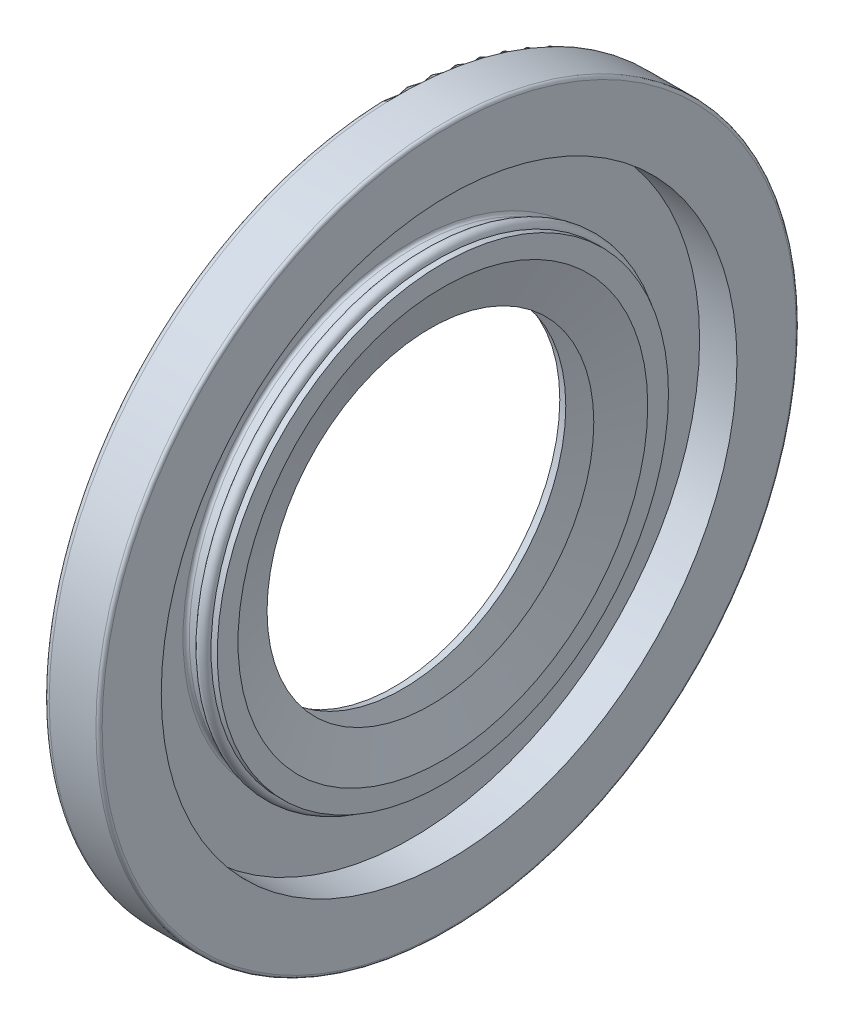
ISO-10303-21;
HEADER;
FILE_DESCRIPTION(('STEP AP214'),'2;1');
FILE_NAME('part.step','',(''),(''),'','','');
FILE_SCHEMA(('AUTOMOTIVE_DESIGN { 1 0 10303 214 1 1 1 1 }'));
ENDSEC;
DATA;
#1=APPLICATION_CONTEXT('core data for automotive mechanical design processes');
#2=APPLICATION_PROTOCOL_DEFINITION('international standard','automotive_design',2000,#1);
#3=PRODUCT_CONTEXT('',#1,'mechanical');
#4=PRODUCT('Part','Part','',(#3));
#5=PRODUCT_RELATED_PRODUCT_CATEGORY('part','',(#4));
#6=PRODUCT_DEFINITION_FORMATION('','',#4);
#7=PRODUCT_DEFINITION_CONTEXT('part definition',#1,'design');
#8=PRODUCT_DEFINITION('design','',#6,#7);
#9=PRODUCT_DEFINITION_SHAPE('','',#8);
#10=(LENGTH_UNIT() NAMED_UNIT(*) SI_UNIT(.MILLI.,.METRE.));
#11=(NAMED_UNIT(*) PLANE_ANGLE_UNIT() SI_UNIT($,.RADIAN.));
#12=(NAMED_UNIT(*) SI_UNIT($,.STERADIAN.) SOLID_ANGLE_UNIT());
#13=UNCERTAINTY_MEASURE_WITH_UNIT(LENGTH_MEASURE(1.E-05),#10,'distance_accuracy_value','');
#14=(GEOMETRIC_REPRESENTATION_CONTEXT(3) GLOBAL_UNCERTAINTY_ASSIGNED_CONTEXT((#13)) GLOBAL_UNIT_ASSIGNED_CONTEXT((#10,
#11,#12)) REPRESENTATION_CONTEXT('',''));
#15=CARTESIAN_POINT('',(0.,0.,0.));
#16=DIRECTION('',(0.,0.,1.));
#17=DIRECTION('',(1.,0.,0.));
#18=AXIS2_PLACEMENT_3D('',#15,#16,#17);
#19=CARTESIAN_POINT('',(0.,73.666666666667,0.));
#20=DIRECTION('',(-1.,0.,0.));
#21=DIRECTION('',(0.,0.,1.));
#22=AXIS2_PLACEMENT_3D('',#19,#20,#21);
#23=PLANE('',#22);
#24=CARTESIAN_POINT('',(0.,0.,0.));
#25=DIRECTION('',(1.,0.,0.));
#26=DIRECTION('',(0.,0.,-1.));
#27=AXIS2_PLACEMENT_3D('',#24,#25,#26);
#28=CIRCLE('',#27,61.666666666667);
#29=CARTESIAN_POINT('',(0.,0.,-61.666666666667));
#30=VERTEX_POINT('',#29);
#31=EDGE_CURVE('E5',#30,#30,#28,.T.);
#32=ORIENTED_EDGE('',*,*,#31,.T.);
#33=EDGE_LOOP('',(#32));
#34=FACE_BOUND('',#33,.T.);
#35=CARTESIAN_POINT('',(0.,0.,0.));
#36=DIRECTION('',(1.,0.,0.));
#37=DIRECTION('',(0.,0.,-1.));
#38=AXIS2_PLACEMENT_3D('',#35,#36,#37);
#39=CIRCLE('',#38,73.6666666666671);
#40=CARTESIAN_POINT('',(0.,0.,-73.6666666666671));
#41=VERTEX_POINT('',#40);
#42=EDGE_CURVE('E9',#41,#41,#39,.T.);
#43=ORIENTED_EDGE('',*,*,#42,.F.);
#44=EDGE_LOOP('',(#43));
#45=FACE_BOUND('',#44,.T.);
#46=ADVANCED_FACE('F13',(#34,#45),#23,.T.);
#47=CARTESIAN_POINT('',(12.,0.,0.));
#48=DIRECTION('',(1.,0.,0.));
#49=DIRECTION('',(0.,0.,-1.));
#50=AXIS2_PLACEMENT_3D('',#47,#48,#49);
#51=CYLINDRICAL_SURFACE('',#50,61.666666666667);
#52=CARTESIAN_POINT('',(0.199999999999999,0.,0.));
#53=DIRECTION('',(1.,0.,0.));
#54=DIRECTION('',(0.,0.,-1.));
#55=AXIS2_PLACEMENT_3D('',#52,#53,#54);
#56=CIRCLE('',#55,61.666666666667);
#57=CARTESIAN_POINT('',(0.199999999999999,0.,-61.666666666667));
#58=VERTEX_POINT('',#57);
#59=EDGE_CURVE('E24',#58,#58,#56,.T.);
#60=ORIENTED_EDGE('',*,*,#59,.T.);
#61=EDGE_LOOP('',(#60));
#62=FACE_BOUND('',#61,.T.);
#63=ORIENTED_EDGE('',*,*,#31,.F.);
#64=EDGE_LOOP('',(#63));
#65=FACE_BOUND('',#64,.T.);
#66=ADVANCED_FACE('F30',(#62,#65),#51,.F.);
#67=CARTESIAN_POINT('',(1.33333333333288,0.,0.));
#68=DIRECTION('',(1.,0.,0.));
#69=DIRECTION('',(0.,0.,-1.));
#70=AXIS2_PLACEMENT_3D('',#67,#68,#69);
#71=TOROIDAL_SURFACE('',#70,73.6666666666671,1.33333333333288);
#72=ORIENTED_EDGE('',*,*,#42,.T.);
#73=EDGE_LOOP('',(#72));
#74=FACE_BOUND('',#73,.T.);
#75=CARTESIAN_POINT('',(1.3333333333333,0.,0.));
#76=DIRECTION('',(1.,0.,0.));
#77=DIRECTION('',(0.,0.,-1.));
#78=AXIS2_PLACEMENT_3D('',#75,#76,#77);
#79=CIRCLE('',#78,75.);
#80=CARTESIAN_POINT('',(1.3333333333333,0.,-75.));
#81=VERTEX_POINT('',#80);
#82=EDGE_CURVE('E39',#81,#81,#79,.T.);
#83=ORIENTED_EDGE('',*,*,#82,.F.);
#84=EDGE_LOOP('',(#83));
#85=FACE_BOUND('',#84,.T.);
#86=ADVANCED_FACE('F43',(#74,#85),#71,.T.);
#87=CARTESIAN_POINT('',(0.2,61.666666666667,0.));
#88=DIRECTION('',(-1.,0.,0.));
#89=DIRECTION('',(0.,0.,1.));
#90=AXIS2_PLACEMENT_3D('',#87,#88,#89);
#91=PLANE('',#90);
#92=CARTESIAN_POINT('',(0.199999999999999,0.,0.));
#93=DIRECTION('',(1.,0.,0.));
#94=DIRECTION('',(0.,0.,-1.));
#95=AXIS2_PLACEMENT_3D('',#92,#93,#94);
#96=CIRCLE('',#95,48.333333333333);
#97=CARTESIAN_POINT('',(0.199999999999999,0.,-48.333333333333));
#98=VERTEX_POINT('',#97);
#99=EDGE_CURVE('E50',#98,#98,#96,.T.);
#100=ORIENTED_EDGE('',*,*,#99,.T.);
#101=EDGE_LOOP('',(#100));
#102=FACE_BOUND('',#101,.T.);
#103=ORIENTED_EDGE('',*,*,#59,.F.);
#104=EDGE_LOOP('',(#103));
#105=FACE_BOUND('',#104,.T.);
#106=ADVANCED_FACE('F56',(#102,#105),#91,.T.);
#107=CARTESIAN_POINT('',(12.,0.,0.));
#108=DIRECTION('',(1.,0.,0.));
#109=DIRECTION('',(0.,0.,-1.));
#110=AXIS2_PLACEMENT_3D('',#107,#108,#109);
#111=CYLINDRICAL_SURFACE('',#110,75.);
#112=ORIENTED_EDGE('',*,*,#82,.T.);
#113=EDGE_LOOP('',(#112));
#114=FACE_BOUND('',#113,.T.);
#115=CARTESIAN_POINT('',(11.333333333333,0.,0.));
#116=DIRECTION('',(1.,0.,0.));
#117=DIRECTION('',(0.,0.,-1.));
#118=AXIS2_PLACEMENT_3D('',#115,#116,#117);
#119=CIRCLE('',#118,75.);
#120=CARTESIAN_POINT('',(11.333333333333,0.,-75.));
#121=VERTEX_POINT('',#120);
#122=EDGE_CURVE('E65',#121,#121,#119,.T.);
#123=ORIENTED_EDGE('',*,*,#122,.F.);
#124=EDGE_LOOP('',(#123));
#125=FACE_BOUND('',#124,.T.);
#126=ADVANCED_FACE('F69',(#114,#125),#111,.T.);
#127=CARTESIAN_POINT('',(12.,0.,0.));
#128=DIRECTION('',(1.,0.,0.));
#129=DIRECTION('',(0.,0.,-1.));
#130=AXIS2_PLACEMENT_3D('',#127,#128,#129);
#131=CYLINDRICAL_SURFACE('',#130,48.333333333333);
#132=CARTESIAN_POINT('',(0.,0.,0.));
#133=DIRECTION('',(1.,0.,0.));
#134=DIRECTION('',(0.,0.,-1.));
#135=AXIS2_PLACEMENT_3D('',#132,#133,#134);
#136=CIRCLE('',#135,48.333333333333);
#137=CARTESIAN_POINT('',(0.,0.,-48.333333333333));
#138=VERTEX_POINT('',#137);
#139=EDGE_CURVE('E76',#138,#138,#136,.T.);
#140=ORIENTED_EDGE('',*,*,#139,.T.);
#141=EDGE_LOOP('',(#140));
#142=FACE_BOUND('',#141,.T.);
#143=ORIENTED_EDGE('',*,*,#99,.F.);
#144=EDGE_LOOP('',(#143));
#145=FACE_BOUND('',#144,.T.);
#146=ADVANCED_FACE('F82',(#142,#145),#131,.T.);
#147=CARTESIAN_POINT('',(11.3333333333321,0.,0.));
#148=DIRECTION('',(1.,0.,0.));
#149=DIRECTION('',(0.,0.,-1.));
#150=AXIS2_PLACEMENT_3D('',#147,#148,#149);
#151=TOROIDAL_SURFACE('',#150,74.3333333333321,0.666666666667901);
#152=ORIENTED_EDGE('',*,*,#122,.T.);
#153=EDGE_LOOP('',(#152));
#154=FACE_BOUND('',#153,.T.);
#155=CARTESIAN_POINT('',(12.,0.,0.));
#156=DIRECTION('',(1.,0.,0.));
#157=DIRECTION('',(0.,0.,-1.));
#158=AXIS2_PLACEMENT_3D('',#155,#156,#157);
#159=CIRCLE('',#158,74.3333333858985);
#160=CARTESIAN_POINT('',(12.,0.,-74.3333333858985));
#161=VERTEX_POINT('',#160);
#162=EDGE_CURVE('E91',#161,#161,#159,.T.);
#163=ORIENTED_EDGE('',*,*,#162,.F.);
#164=EDGE_LOOP('',(#163));
#165=FACE_BOUND('',#164,.T.);
#166=ADVANCED_FACE('F95',(#154,#165),#151,.T.);
#167=CARTESIAN_POINT('',(0.,48.333333333333,0.));
#168=DIRECTION('',(-1.,0.,0.));
#169=DIRECTION('',(0.,0.,1.));
#170=AXIS2_PLACEMENT_3D('',#167,#168,#169);
#171=PLANE('',#170);
#172=CARTESIAN_POINT('',(0.,0.,0.));
#173=DIRECTION('',(1.,0.,0.));
#174=DIRECTION('',(0.,0.,-1.));
#175=AXIS2_PLACEMENT_3D('',#172,#173,#174);
#176=CIRCLE('',#175,45.);
#177=CARTESIAN_POINT('',(0.,0.,-45.));
#178=VERTEX_POINT('',#177);
#179=EDGE_CURVE('E102',#178,#178,#176,.T.);
#180=ORIENTED_EDGE('',*,*,#179,.T.);
#181=EDGE_LOOP('',(#180));
#182=FACE_BOUND('',#181,.T.);
#183=ORIENTED_EDGE('',*,*,#139,.F.);
#184=EDGE_LOOP('',(#183));
#185=FACE_BOUND('',#184,.T.);
#186=ADVANCED_FACE('F108',(#182,#185),#171,.T.);
#187=CARTESIAN_POINT('',(12.,61.666666666667,0.));
#188=DIRECTION('',(1.,0.,0.));
#189=DIRECTION('',(0.,0.,-1.));
#190=AXIS2_PLACEMENT_3D('',#187,#188,#189);
#191=PLANE('',#190);
#192=ORIENTED_EDGE('',*,*,#162,.T.);
#193=EDGE_LOOP('',(#192));
#194=FACE_BOUND('',#193,.T.);
#195=CARTESIAN_POINT('',(12.,0.,0.));
#196=DIRECTION('',(1.,0.,0.));
#197=DIRECTION('',(0.,0.,-1.));
#198=AXIS2_PLACEMENT_3D('',#195,#196,#197);
#199=CIRCLE('',#198,61.666666666667);
#200=CARTESIAN_POINT('',(12.,0.,-61.666666666667));
#201=VERTEX_POINT('',#200);
#202=EDGE_CURVE('E117',#201,#201,#199,.T.);
#203=ORIENTED_EDGE('',*,*,#202,.F.);
#204=EDGE_LOOP('',(#203));
#205=FACE_BOUND('',#204,.T.);
#206=ADVANCED_FACE('F121',(#194,#205),#191,.T.);
#207=CARTESIAN_POINT('',(0.,0.,0.));
#208=DIRECTION('',(-1.,0.,0.));
#209=DIRECTION('',(0.,0.,1.));
#210=AXIS2_PLACEMENT_3D('',#207,#208,#209);
#211=CONICAL_SURFACE('',#210,45.,1.03037682652427);
#212=CARTESIAN_POINT('',(2.,0.,0.));
#213=DIRECTION('',(1.,0.,0.));
#214=DIRECTION('',(0.,0.,-1.));
#215=AXIS2_PLACEMENT_3D('',#212,#213,#214);
#216=CIRCLE('',#215,41.666666666667);
#217=CARTESIAN_POINT('',(2.,0.,-41.666666666667));
#218=VERTEX_POINT('',#217);
#219=EDGE_CURVE('E128',#218,#218,#216,.T.);
#220=ORIENTED_EDGE('',*,*,#219,.T.);
#221=EDGE_LOOP('',(#220));
#222=FACE_BOUND('',#221,.T.);
#223=ORIENTED_EDGE('',*,*,#179,.F.);
#224=EDGE_LOOP('',(#223));
#225=FACE_BOUND('',#224,.T.);
#226=ADVANCED_FACE('F134',(#222,#225),#211,.F.);
#227=CARTESIAN_POINT('',(12.,0.,0.));
#228=DIRECTION('',(1.,0.,0.));
#229=DIRECTION('',(0.,0.,-1.));
#230=AXIS2_PLACEMENT_3D('',#227,#228,#229);
#231=CYLINDRICAL_SURFACE('',#230,61.666666666667);
#232=ORIENTED_EDGE('',*,*,#202,.T.);
#233=EDGE_LOOP('',(#232));
#234=FACE_BOUND('',#233,.T.);
#235=CARTESIAN_POINT('',(4.,0.,0.));
#236=DIRECTION('',(1.,0.,0.));
#237=DIRECTION('',(0.,0.,-1.));
#238=AXIS2_PLACEMENT_3D('',#235,#236,#237);
#239=CIRCLE('',#238,61.666666666667);
#240=CARTESIAN_POINT('',(4.,0.,-61.666666666667));
#241=VERTEX_POINT('',#240);
#242=EDGE_CURVE('E143',#241,#241,#239,.T.);
#243=ORIENTED_EDGE('',*,*,#242,.F.);
#244=EDGE_LOOP('',(#243));
#245=FACE_BOUND('',#244,.T.);
#246=ADVANCED_FACE('F147',(#234,#245),#231,.F.);
#247=CARTESIAN_POINT('',(2.,0.,0.));
#248=DIRECTION('',(1.,0.,0.));
#249=DIRECTION('',(0.,0.,-1.));
#250=AXIS2_PLACEMENT_3D('',#247,#248,#249);
#251=CONICAL_SURFACE('',#250,41.666666666667,1.27933953231706);
#252=CARTESIAN_POINT('',(0.165137614678901,0.,0.));
#253=DIRECTION('',(1.,0.,0.));
#254=DIRECTION('',(0.,0.,-1.));
#255=AXIS2_PLACEMENT_3D('',#252,#253,#254);
#256=CIRCLE('',#255,35.550458715596);
#257=CARTESIAN_POINT('',(0.165137614678901,0.,-35.550458715596));
#258=VERTEX_POINT('',#257);
#259=EDGE_CURVE('E154',#258,#258,#256,.T.);
#260=ORIENTED_EDGE('',*,*,#259,.T.);
#261=EDGE_LOOP('',(#260));
#262=FACE_BOUND('',#261,.T.);
#263=ORIENTED_EDGE('',*,*,#219,.F.);
#264=EDGE_LOOP('',(#263));
#265=FACE_BOUND('',#264,.T.);
#266=ADVANCED_FACE('F160',(#262,#265),#251,.T.);
#267=CARTESIAN_POINT('',(4.,48.999999833333,0.));
#268=DIRECTION('',(1.,0.,0.));
#269=DIRECTION('',(0.,0.,-1.));
#270=AXIS2_PLACEMENT_3D('',#267,#268,#269);
#271=PLANE('',#270);
#272=ORIENTED_EDGE('',*,*,#242,.T.);
#273=EDGE_LOOP('',(#272));
#274=FACE_BOUND('',#273,.T.);
#275=CARTESIAN_POINT('',(4.,0.,0.));
#276=DIRECTION('',(1.,0.,0.));
#277=DIRECTION('',(0.,0.,-1.));
#278=AXIS2_PLACEMENT_3D('',#275,#276,#277);
#279=CIRCLE('',#278,48.9999998921038);
#280=CARTESIAN_POINT('',(4.,0.,-48.9999998921038));
#281=VERTEX_POINT('',#280);
#282=EDGE_CURVE('E169',#281,#281,#279,.T.);
#283=ORIENTED_EDGE('',*,*,#282,.F.);
#284=EDGE_LOOP('',(#283));
#285=FACE_BOUND('',#284,.T.);
#286=ADVANCED_FACE('F173',(#274,#285),#271,.T.);
#287=CARTESIAN_POINT('',(0.165137614678901,0.,0.));
#288=DIRECTION('',(-1.,0.,0.));
#289=DIRECTION('',(0.,0.,1.));
#290=AXIS2_PLACEMENT_3D('',#287,#288,#289);
#291=CONICAL_SURFACE('',#290,35.550458715596,0.291456794477702);
#292=CARTESIAN_POINT('',(2.,0.,0.));
#293=DIRECTION('',(1.,0.,0.));
#294=DIRECTION('',(0.,0.,-1.));
#295=AXIS2_PLACEMENT_3D('',#292,#293,#294);
#296=CIRCLE('',#295,35.);
#297=CARTESIAN_POINT('',(2.,0.,-35.));
#298=VERTEX_POINT('',#297);
#299=EDGE_CURVE('E180',#298,#298,#296,.T.);
#300=ORIENTED_EDGE('',*,*,#299,.T.);
#301=EDGE_LOOP('',(#300));
#302=FACE_BOUND('',#301,.T.);
#303=ORIENTED_EDGE('',*,*,#259,.F.);
#304=EDGE_LOOP('',(#303));
#305=FACE_BOUND('',#304,.T.);
#306=ADVANCED_FACE('F186',(#302,#305),#291,.F.);
#307=CARTESIAN_POINT('',(4.66666649999982,0.,0.));
#308=DIRECTION('',(1.,0.,0.));
#309=DIRECTION('',(0.,0.,-1.));
#310=AXIS2_PLACEMENT_3D('',#307,#308,#309);
#311=TOROIDAL_SURFACE('',#310,48.9999998333328,0.666666499999823);
#312=CARTESIAN_POINT('',(4.6666665,0.,0.));
#313=DIRECTION('',(1.,0.,0.));
#314=DIRECTION('',(0.,0.,-1.));
#315=AXIS2_PLACEMENT_3D('',#312,#313,#314);
#316=CIRCLE('',#315,48.333333333333);
#317=CARTESIAN_POINT('',(4.6666665,0.,-48.333333333333));
#318=VERTEX_POINT('',#317);
#319=EDGE_CURVE('E193',#318,#318,#316,.T.);
#320=ORIENTED_EDGE('',*,*,#319,.F.);
#321=EDGE_LOOP('',(#320));
#322=FACE_BOUND('',#321,.T.);
#323=ORIENTED_EDGE('',*,*,#282,.T.);
#324=EDGE_LOOP('',(#323));
#325=FACE_BOUND('',#324,.T.);
#326=ADVANCED_FACE('F199',(#322,#325),#311,.F.);
#327=CARTESIAN_POINT('',(2.,0.,0.));
#328=DIRECTION('',(1.,0.,0.));
#329=DIRECTION('',(0.,0.,-1.));
#330=AXIS2_PLACEMENT_3D('',#327,#328,#329);
#331=CONICAL_SURFACE('',#330,35.,1.27933953231704);
#332=CARTESIAN_POINT('',(4.,0.,0.));
#333=DIRECTION('',(1.,0.,0.));
#334=DIRECTION('',(0.,0.,-1.));
#335=AXIS2_PLACEMENT_3D('',#332,#333,#334);
#336=CIRCLE('',#335,41.666666666667);
#337=CARTESIAN_POINT('',(4.,0.,-41.666666666667));
#338=VERTEX_POINT('',#337);
#339=EDGE_CURVE('E206',#338,#338,#336,.T.);
#340=ORIENTED_EDGE('',*,*,#339,.T.);
#341=EDGE_LOOP('',(#340));
#342=FACE_BOUND('',#341,.T.);
#343=ORIENTED_EDGE('',*,*,#299,.F.);
#344=EDGE_LOOP('',(#343));
#345=FACE_BOUND('',#344,.T.);
#346=ADVANCED_FACE('F212',(#342,#345),#331,.F.);
#347=CARTESIAN_POINT('',(12.,0.,0.));
#348=DIRECTION('',(1.,0.,0.));
#349=DIRECTION('',(0.,0.,-1.));
#350=AXIS2_PLACEMENT_3D('',#347,#348,#349);
#351=CYLINDRICAL_SURFACE('',#350,48.333333333333);
#352=ORIENTED_EDGE('',*,*,#319,.T.);
#353=EDGE_LOOP('',(#352));
#354=FACE_BOUND('',#353,.T.);
#355=CARTESIAN_POINT('',(6.666667,0.,0.));
#356=DIRECTION('',(1.,0.,0.));
#357=DIRECTION('',(0.,0.,-1.));
#358=AXIS2_PLACEMENT_3D('',#355,#356,#357);
#359=CIRCLE('',#358,48.333333333333);
#360=CARTESIAN_POINT('',(6.666667,0.,-48.333333333333));
#361=VERTEX_POINT('',#360);
#362=EDGE_CURVE('E221',#361,#361,#359,.T.);
#363=ORIENTED_EDGE('',*,*,#362,.F.);
#364=EDGE_LOOP('',(#363));
#365=FACE_BOUND('',#364,.T.);
#366=ADVANCED_FACE('F225',(#354,#365),#351,.T.);
#367=CARTESIAN_POINT('',(4.,0.,0.));
#368=DIRECTION('',(-1.,0.,0.));
#369=DIRECTION('',(0.,0.,1.));
#370=AXIS2_PLACEMENT_3D('',#367,#368,#369);
#371=CONICAL_SURFACE('',#370,41.666666666667,1.03037682652433);
#372=CARTESIAN_POINT('',(8.,0.,0.));
#373=DIRECTION('',(1.,0.,0.));
#374=DIRECTION('',(0.,0.,-1.));
#375=AXIS2_PLACEMENT_3D('',#372,#373,#374);
#376=CIRCLE('',#375,35.);
#377=CARTESIAN_POINT('',(8.,0.,-35.));
#378=VERTEX_POINT('',#377);
#379=EDGE_CURVE('E232',#378,#378,#376,.T.);
#380=ORIENTED_EDGE('',*,*,#379,.T.);
#381=EDGE_LOOP('',(#380));
#382=FACE_BOUND('',#381,.T.);
#383=ORIENTED_EDGE('',*,*,#339,.F.);
#384=EDGE_LOOP('',(#383));
#385=FACE_BOUND('',#384,.T.);
#386=ADVANCED_FACE('F238',(#382,#385),#371,.F.);
#387=CARTESIAN_POINT('',(8.,0.,0.));
#388=DIRECTION('',(1.,0.,0.));
#389=DIRECTION('',(0.,0.,-1.));
#390=AXIS2_PLACEMENT_3D('',#387,#388,#389);
#391=TOROIDAL_SURFACE('',#390,48.333333333333,1.333333);
#392=ORIENTED_EDGE('',*,*,#362,.T.);
#393=EDGE_LOOP('',(#392));
#394=FACE_BOUND('',#393,.T.);
#395=CARTESIAN_POINT('',(9.333333,0.,0.));
#396=DIRECTION('',(1.,0.,0.));
#397=DIRECTION('',(0.,0.,-1.));
#398=AXIS2_PLACEMENT_3D('',#395,#396,#397);
#399=CIRCLE('',#398,48.333333333333);
#400=CARTESIAN_POINT('',(9.333333,0.,-48.333333333333));
#401=VERTEX_POINT('',#400);
#402=EDGE_CURVE('E247',#401,#401,#399,.T.);
#403=ORIENTED_EDGE('',*,*,#402,.F.);
#404=EDGE_LOOP('',(#403));
#405=FACE_BOUND('',#404,.T.);
#406=ADVANCED_FACE('F251',(#394,#405),#391,.T.);
#407=CARTESIAN_POINT('',(8.,0.,0.));
#408=DIRECTION('',(1.,0.,0.));
#409=DIRECTION('',(0.,0.,-1.));
#410=AXIS2_PLACEMENT_3D('',#407,#408,#409);
#411=CONICAL_SURFACE('',#410,35.,1.27933953231702);
#412=CARTESIAN_POINT('',(10.6666665,0.,0.));
#413=DIRECTION('',(1.,0.,0.));
#414=DIRECTION('',(0.,0.,-1.));
#415=AXIS2_PLACEMENT_3D('',#412,#413,#414);
#416=CIRCLE('',#415,43.888888333333);
#417=CARTESIAN_POINT('',(10.6666665,0.,-43.888888333333));
#418=VERTEX_POINT('',#417);
#419=EDGE_CURVE('E258',#418,#418,#416,.T.);
#420=ORIENTED_EDGE('',*,*,#419,.T.);
#421=EDGE_LOOP('',(#420));
#422=FACE_BOUND('',#421,.T.);
#423=ORIENTED_EDGE('',*,*,#379,.F.);
#424=EDGE_LOOP('',(#423));
#425=FACE_BOUND('',#424,.T.);
#426=ADVANCED_FACE('F264',(#422,#425),#411,.F.);
#427=CARTESIAN_POINT('',(12.,0.,0.));
#428=DIRECTION('',(1.,0.,0.));
#429=DIRECTION('',(0.,0.,-1.));
#430=AXIS2_PLACEMENT_3D('',#427,#428,#429);
#431=CYLINDRICAL_SURFACE('',#430,48.333333333333);
#432=ORIENTED_EDGE('',*,*,#402,.T.);
#433=EDGE_LOOP('',(#432));
#434=FACE_BOUND('',#433,.T.);
#435=CARTESIAN_POINT('',(10.6666665,0.,0.));
#436=DIRECTION('',(1.,0.,0.));
#437=DIRECTION('',(0.,0.,-1.));
#438=AXIS2_PLACEMENT_3D('',#435,#436,#437);
#439=CIRCLE('',#438,48.333333333333);
#440=CARTESIAN_POINT('',(10.6666665,0.,-48.333333333333));
#441=VERTEX_POINT('',#440);
#442=EDGE_CURVE('E273',#441,#441,#439,.T.);
#443=ORIENTED_EDGE('',*,*,#442,.F.);
#444=EDGE_LOOP('',(#443));
#445=FACE_BOUND('',#444,.T.);
#446=ADVANCED_FACE('F277',(#434,#445),#431,.T.);
#447=CARTESIAN_POINT('',(10.6666665,43.888888333333,0.));
#448=DIRECTION('',(1.,0.,0.));
#449=DIRECTION('',(0.,0.,-1.));
#450=AXIS2_PLACEMENT_3D('',#447,#448,#449);
#451=PLANE('',#450);
#452=ORIENTED_EDGE('',*,*,#442,.T.);
#453=EDGE_LOOP('',(#452));
#454=FACE_BOUND('',#453,.T.);
#455=ORIENTED_EDGE('',*,*,#419,.F.);
#456=EDGE_LOOP('',(#455));
#457=FACE_BOUND('',#456,.T.);
#458=ADVANCED_FACE('F288',(#454,#457),#451,.T.);
#459=CLOSED_SHELL('',(#46,#66,#86,#106,#126,#146,#166,#186,#206,#226,#246,#266,#286,#306,#326,
#346,#366,#386,#406,#426,#446,#458));
#460=MANIFOLD_SOLID_BREP('B1',#459);
#461=ADVANCED_BREP_SHAPE_REPRESENTATION('',(#18,#460),#14);
#462=SHAPE_DEFINITION_REPRESENTATION(#9,#461);
ENDSEC;
END-ISO-10303-21;
